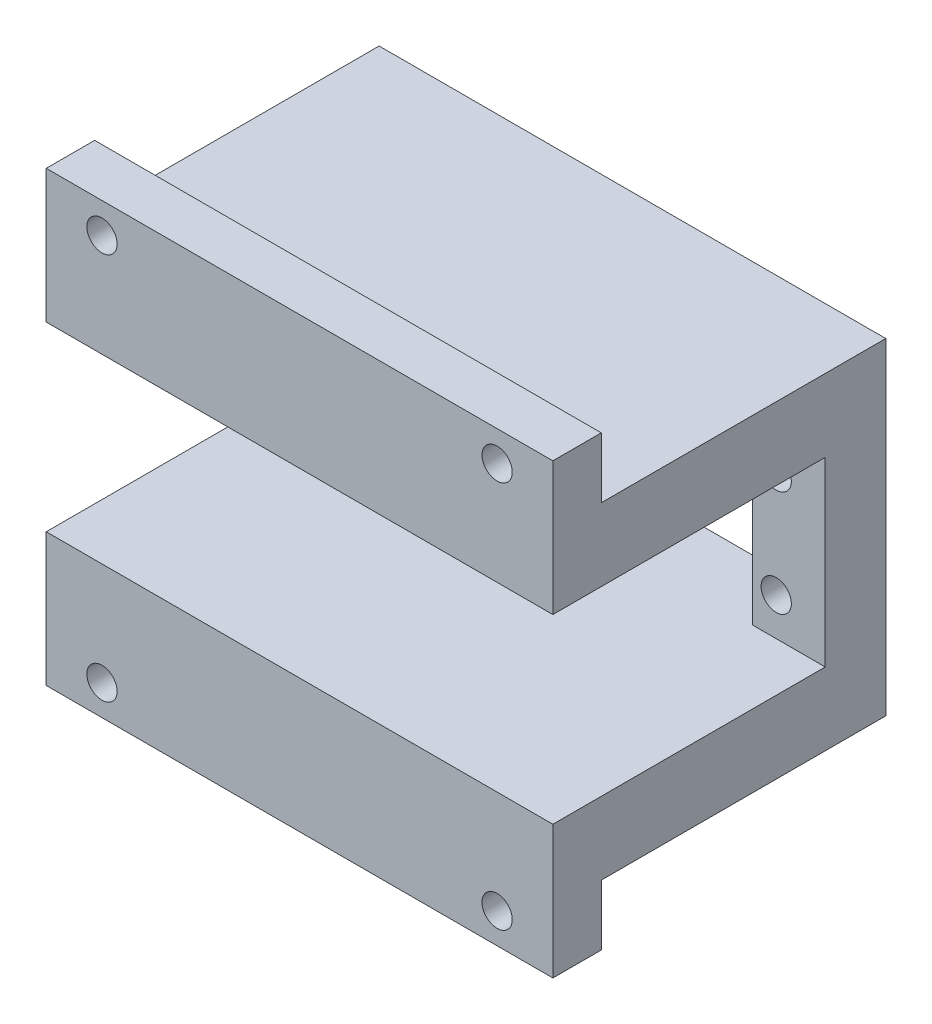
ISO-10303-21;
HEADER;
FILE_DESCRIPTION(('STEP AP214'),'2;1');
FILE_NAME('part.step','',(''),(''),'','','');
FILE_SCHEMA(('AUTOMOTIVE_DESIGN { 1 0 10303 214 1 1 1 1 }'));
ENDSEC;
DATA;
#1=APPLICATION_CONTEXT('core data for automotive mechanical design processes');
#2=APPLICATION_PROTOCOL_DEFINITION('international standard','automotive_design',2000,#1);
#3=PRODUCT_CONTEXT('',#1,'mechanical');
#4=PRODUCT('Part','Part','',(#3));
#5=PRODUCT_RELATED_PRODUCT_CATEGORY('part','',(#4));
#6=PRODUCT_DEFINITION_FORMATION('','',#4);
#7=PRODUCT_DEFINITION_CONTEXT('part definition',#1,'design');
#8=PRODUCT_DEFINITION('design','',#6,#7);
#9=PRODUCT_DEFINITION_SHAPE('','',#8);
#10=(LENGTH_UNIT() NAMED_UNIT(*) SI_UNIT(.MILLI.,.METRE.));
#11=(NAMED_UNIT(*) PLANE_ANGLE_UNIT() SI_UNIT($,.RADIAN.));
#12=(NAMED_UNIT(*) SI_UNIT($,.STERADIAN.) SOLID_ANGLE_UNIT());
#13=UNCERTAINTY_MEASURE_WITH_UNIT(LENGTH_MEASURE(1.E-05),#10,'distance_accuracy_value','');
#14=(GEOMETRIC_REPRESENTATION_CONTEXT(3) GLOBAL_UNCERTAINTY_ASSIGNED_CONTEXT((#13)) GLOBAL_UNIT_ASSIGNED_CONTEXT((#10,
#11,#12)) REPRESENTATION_CONTEXT('',''));
#15=CARTESIAN_POINT('',(0.,0.,0.));
#16=DIRECTION('',(0.,0.,1.));
#17=DIRECTION('',(1.,0.,0.));
#18=AXIS2_PLACEMENT_3D('',#15,#16,#17);
#19=CARTESIAN_POINT('',(-33.0810846652941,-3.76336844075865,10.));
#20=DIRECTION('',(0.,1.,0.));
#21=DIRECTION('',(-1.,0.,0.));
#22=AXIS2_PLACEMENT_3D('',#19,#20,#21);
#23=PLANE('',#22);
#24=DIRECTION('',(1.,0.,0.));
#25=VECTOR('',#24,1.);
#26=CARTESIAN_POINT('',(-33.0810846652941,-3.76336844075865,47.));
#27=LINE('',#26,#25);
#28=CARTESIAN_POINT('',(-33.0810846652941,-3.76336844075865,47.));
#29=VERTEX_POINT('',#28);
#30=CARTESIAN_POINT('',(50.6189153347059,-3.76336844075865,47.));
#31=VERTEX_POINT('',#30);
#32=EDGE_CURVE('E56',#29,#31,#27,.T.);
#33=ORIENTED_EDGE('',*,*,#32,.F.);
#34=DIRECTION('',(0.,0.,-1.));
#35=VECTOR('',#34,1.);
#36=CARTESIAN_POINT('',(-33.0810846652941,-3.76336844075865,10.));
#37=LINE('',#36,#35);
#38=CARTESIAN_POINT('',(-33.0810846652941,-3.76336844075865,0.));
#39=VERTEX_POINT('',#38);
#40=EDGE_CURVE('E348',#29,#39,#37,.T.);
#41=ORIENTED_EDGE('',*,*,#40,.T.);
#42=DIRECTION('',(1.,0.,0.));
#43=VECTOR('',#42,1.);
#44=CARTESIAN_POINT('',(-33.0810846652941,-3.76336844075865,0.));
#45=LINE('',#44,#43);
#46=CARTESIAN_POINT('',(50.6189153347059,-3.76336844075865,0.));
#47=VERTEX_POINT('',#46);
#48=EDGE_CURVE('E341',#39,#47,#45,.T.);
#49=ORIENTED_EDGE('',*,*,#48,.T.);
#50=DIRECTION('',(0.,0.,-1.));
#51=VECTOR('',#50,1.);
#52=CARTESIAN_POINT('',(50.6189153347059,-3.76336844075865,10.));
#53=LINE('',#52,#51);
#54=EDGE_CURVE('E35',#31,#47,#53,.T.);
#55=ORIENTED_EDGE('',*,*,#54,.F.);
#56=EDGE_LOOP('',(#33,#41,#49,#55));
#57=FACE_BOUND('',#56,.T.);
#58=ADVANCED_FACE('F32',(#57),#23,.F.);
#59=CARTESIAN_POINT('',(0.,0.,10.));
#60=DIRECTION('',(0.,0.,1.));
#61=DIRECTION('',(1.,0.,0.));
#62=AXIS2_PLACEMENT_3D('',#59,#60,#61);
#63=PLANE('',#62);
#64=CARTESIAN_POINT('',(42.5189153347059,31.9866315592413,10.));
#65=DIRECTION('',(0.,0.,1.));
#66=DIRECTION('',(1.,0.,0.));
#67=AXIS2_PLACEMENT_3D('',#64,#65,#66);
#68=CIRCLE('',#67,2.5);
#69=CARTESIAN_POINT('',(45.0189153347059,31.9866315592413,10.));
#70=VERTEX_POINT('',#69);
#71=EDGE_CURVE('E266',#70,#70,#68,.T.);
#72=ORIENTED_EDGE('',*,*,#71,.F.);
#73=EDGE_LOOP('',(#72));
#74=FACE_BOUND('',#73,.T.);
#75=CARTESIAN_POINT('',(42.5189153347059,14.4866315592413,10.));
#76=DIRECTION('',(0.,0.,1.));
#77=DIRECTION('',(-1.,0.,0.));
#78=AXIS2_PLACEMENT_3D('',#75,#76,#77);
#79=CIRCLE('',#78,2.5);
#80=CARTESIAN_POINT('',(40.0189153347059,14.4866315592413,10.));
#81=VERTEX_POINT('',#80);
#82=EDGE_CURVE('E260',#81,#81,#79,.T.);
#83=ORIENTED_EDGE('',*,*,#82,.F.);
#84=EDGE_LOOP('',(#83));
#85=FACE_BOUND('',#84,.T.);
#86=DIRECTION('',(0.,1.,0.));
#87=VECTOR('',#86,1.);
#88=CARTESIAN_POINT('',(50.6189153347059,-3.76336844075865,10.));
#89=LINE('',#88,#87);
#90=CARTESIAN_POINT('',(50.6189153347059,8.23663155924135,10.));
#91=VERTEX_POINT('',#90);
#92=CARTESIAN_POINT('',(50.6189153347059,38.2366315592414,10.));
#93=VERTEX_POINT('',#92);
#94=EDGE_CURVE('E342',#91,#93,#89,.T.);
#95=ORIENTED_EDGE('',*,*,#94,.T.);
#96=DIRECTION('',(1.,0.,0.));
#97=VECTOR('',#96,1.);
#98=CARTESIAN_POINT('',(-33.0810846652941,38.2366315592413,10.));
#99=LINE('',#98,#97);
#100=CARTESIAN_POINT('',(38.6189153347059,38.2366315592414,10.));
#101=VERTEX_POINT('',#100);
#102=EDGE_CURVE('E236',#101,#93,#99,.T.);
#103=ORIENTED_EDGE('',*,*,#102,.F.);
#104=DIRECTION('',(0.,1.,0.));
#105=VECTOR('',#104,1.);
#106=CARTESIAN_POINT('',(38.6189153347059,8.23663155924135,10.));
#107=LINE('',#106,#105);
#108=CARTESIAN_POINT('',(38.6189153347059,8.23663155924135,10.));
#109=VERTEX_POINT('',#108);
#110=EDGE_CURVE('E292',#109,#101,#107,.T.);
#111=ORIENTED_EDGE('',*,*,#110,.F.);
#112=DIRECTION('',(-1.,0.,0.));
#113=VECTOR('',#112,1.);
#114=CARTESIAN_POINT('',(-33.0810846652941,8.23663155924135,10.));
#115=LINE('',#114,#113);
#116=EDGE_CURVE('E41',#91,#109,#115,.T.);
#117=ORIENTED_EDGE('',*,*,#116,.F.);
#118=EDGE_LOOP('',(#95,#103,#111,#117));
#119=FACE_BOUND('',#118,.T.);
#120=ADVANCED_FACE('F394',(#74,#85,#119),#63,.T.);
#121=CARTESIAN_POINT('',(-24.9810846652941,31.9866315592413,10.));
#122=DIRECTION('',(0.,0.,1.));
#123=DIRECTION('',(-1.,0.,0.));
#124=AXIS2_PLACEMENT_3D('',#121,#122,#123);
#125=CIRCLE('',#124,2.5);
#126=CARTESIAN_POINT('',(-27.4810846652941,31.9866315592413,10.));
#127=VERTEX_POINT('',#126);
#128=EDGE_CURVE('E272',#127,#127,#125,.T.);
#129=ORIENTED_EDGE('',*,*,#128,.F.);
#130=EDGE_LOOP('',(#129));
#131=FACE_BOUND('',#130,.T.);
#132=CARTESIAN_POINT('',(-24.9810846652941,14.4866315592413,10.));
#133=DIRECTION('',(0.,0.,1.));
#134=DIRECTION('',(1.,0.,0.));
#135=AXIS2_PLACEMENT_3D('',#132,#133,#134);
#136=CIRCLE('',#135,2.5);
#137=CARTESIAN_POINT('',(-22.4810846652941,14.4866315592413,10.));
#138=VERTEX_POINT('',#137);
#139=EDGE_CURVE('E278',#138,#138,#136,.T.);
#140=ORIENTED_EDGE('',*,*,#139,.F.);
#141=EDGE_LOOP('',(#140));
#142=FACE_BOUND('',#141,.T.);
#143=DIRECTION('',(0.,-1.,0.));
#144=VECTOR('',#143,1.);
#145=CARTESIAN_POINT('',(-21.0810846652941,38.2366315592413,10.));
#146=LINE('',#145,#144);
#147=CARTESIAN_POINT('',(-21.0810846652941,38.2366315592413,10.));
#148=VERTEX_POINT('',#147);
#149=CARTESIAN_POINT('',(-21.0810846652941,26.7366315592413,10.));
#150=VERTEX_POINT('',#149);
#151=EDGE_CURVE('E295',#148,#150,#146,.T.);
#152=ORIENTED_EDGE('',*,*,#151,.F.);
#153=CARTESIAN_POINT('',(-33.0810846652941,38.2366315592413,10.));
#154=VERTEX_POINT('',#153);
#155=EDGE_CURVE('E239',#154,#148,#99,.T.);
#156=ORIENTED_EDGE('',*,*,#155,.F.);
#157=DIRECTION('',(0.,-1.,0.));
#158=VECTOR('',#157,1.);
#159=CARTESIAN_POINT('',(-33.0810846652941,7.26530537986886,10.));
#160=LINE('',#159,#158);
#161=CARTESIAN_POINT('',(-33.0810846652941,8.23663155924135,10.));
#162=VERTEX_POINT('',#161);
#163=EDGE_CURVE('E345',#154,#162,#160,.T.);
#164=ORIENTED_EDGE('',*,*,#163,.T.);
#165=CARTESIAN_POINT('',(-21.0810846652941,8.23663155924135,10.));
#166=VERTEX_POINT('',#165);
#167=EDGE_CURVE('E11',#166,#162,#115,.T.);
#168=ORIENTED_EDGE('',*,*,#167,.F.);
#169=DIRECTION('',(0.,-1.,0.));
#170=VECTOR('',#169,1.);
#171=CARTESIAN_POINT('',(-21.0810846652941,19.7366315592413,10.));
#172=LINE('',#171,#170);
#173=CARTESIAN_POINT('',(-21.0810846652941,19.7366315592413,10.));
#174=VERTEX_POINT('',#173);
#175=EDGE_CURVE('E289',#174,#166,#172,.T.);
#176=ORIENTED_EDGE('',*,*,#175,.F.);
#177=DIRECTION('',(1.,0.,0.));
#178=VECTOR('',#177,1.);
#179=CARTESIAN_POINT('',(-24.6810846652941,19.7366315592413,10.));
#180=LINE('',#179,#178);
#181=CARTESIAN_POINT('',(-24.6810846652941,19.7366315592413,10.));
#182=VERTEX_POINT('',#181);
#183=EDGE_CURVE('E286',#182,#174,#180,.T.);
#184=ORIENTED_EDGE('',*,*,#183,.F.);
#185=CARTESIAN_POINT('',(-24.7796957764052,23.2366315592413,10.));
#186=DIRECTION('',(0.,0.,1.));
#187=DIRECTION('',(1.,0.,0.));
#188=AXIS2_PLACEMENT_3D('',#185,#186,#187);
#189=CIRCLE('',#188,3.50138888888889);
#190=CARTESIAN_POINT('',(-24.6810846652941,26.7366315592413,10.));
#191=VERTEX_POINT('',#190);
#192=EDGE_CURVE('E284',#191,#182,#189,.T.);
#193=ORIENTED_EDGE('',*,*,#192,.F.);
#194=DIRECTION('',(-1.,0.,0.));
#195=VECTOR('',#194,1.);
#196=CARTESIAN_POINT('',(-24.6810846652941,26.7366315592413,10.));
#197=LINE('',#196,#195);
#198=EDGE_CURVE('E298',#150,#191,#197,.T.);
#199=ORIENTED_EDGE('',*,*,#198,.F.);
#200=EDGE_LOOP('',(#152,#156,#164,#168,#176,#184,#193,#199));
#201=FACE_BOUND('',#200,.T.);
#202=ADVANCED_FACE('F398',(#131,#142,#201),#63,.T.);
#203=CARTESIAN_POINT('',(0.,0.,0.));
#204=DIRECTION('',(0.,0.,1.));
#205=DIRECTION('',(1.,0.,0.));
#206=AXIS2_PLACEMENT_3D('',#203,#204,#205);
#207=PLANE('',#206);
#208=ORIENTED_EDGE('',*,*,#48,.F.);
#209=DIRECTION('',(0.,-1.,0.));
#210=VECTOR('',#209,1.);
#211=CARTESIAN_POINT('',(-33.0810846652941,4.52284595737369,0.));
#212=LINE('',#211,#210);
#213=CARTESIAN_POINT('',(-33.0810846652941,50.2366315592414,0.));
#214=VERTEX_POINT('',#213);
#215=EDGE_CURVE('E346',#214,#39,#212,.T.);
#216=ORIENTED_EDGE('',*,*,#215,.F.);
#217=DIRECTION('',(-1.,0.,0.));
#218=VECTOR('',#217,1.);
#219=CARTESIAN_POINT('',(-33.0810846652941,50.2366315592414,0.));
#220=LINE('',#219,#218);
#221=CARTESIAN_POINT('',(50.6189153347059,50.2366315592414,0.));
#222=VERTEX_POINT('',#221);
#223=EDGE_CURVE('E354',#222,#214,#220,.T.);
#224=ORIENTED_EDGE('',*,*,#223,.F.);
#225=DIRECTION('',(0.,1.,0.));
#226=VECTOR('',#225,1.);
#227=CARTESIAN_POINT('',(50.6189153347059,4.52284595737371,0.));
#228=LINE('',#227,#226);
#229=EDGE_CURVE('E351',#47,#222,#228,.T.);
#230=ORIENTED_EDGE('',*,*,#229,.F.);
#231=EDGE_LOOP('',(#208,#216,#224,#230));
#232=FACE_BOUND('',#231,.T.);
#233=CARTESIAN_POINT('',(-24.7796957764052,23.2366315592413,0.));
#234=DIRECTION('',(0.,0.,1.));
#235=DIRECTION('',(1.,0.,0.));
#236=AXIS2_PLACEMENT_3D('',#233,#234,#235);
#237=CIRCLE('',#236,3.50138888888889);
#238=CARTESIAN_POINT('',(-24.6810846652941,26.7366315592413,0.));
#239=VERTEX_POINT('',#238);
#240=CARTESIAN_POINT('',(-24.6810846652941,19.7366315592413,0.));
#241=VERTEX_POINT('',#240);
#242=EDGE_CURVE('E281',#239,#241,#237,.T.);
#243=ORIENTED_EDGE('',*,*,#242,.T.);
#244=DIRECTION('',(1.,0.,0.));
#245=VECTOR('',#244,1.);
#246=CARTESIAN_POINT('',(-24.6810846652941,19.7366315592413,0.));
#247=LINE('',#246,#245);
#248=CARTESIAN_POINT('',(-21.0810846652941,19.7366315592413,0.));
#249=VERTEX_POINT('',#248);
#250=EDGE_CURVE('E303',#241,#249,#247,.T.);
#251=ORIENTED_EDGE('',*,*,#250,.T.);
#252=DIRECTION('',(0.,-1.,0.));
#253=VECTOR('',#252,1.);
#254=CARTESIAN_POINT('',(-21.0810846652941,19.7366315592413,0.));
#255=LINE('',#254,#253);
#256=CARTESIAN_POINT('',(-21.0810846652941,8.23663155924135,0.));
#257=VERTEX_POINT('',#256);
#258=EDGE_CURVE('E306',#249,#257,#255,.T.);
#259=ORIENTED_EDGE('',*,*,#258,.T.);
#260=DIRECTION('',(1.,0.,0.));
#261=VECTOR('',#260,1.);
#262=CARTESIAN_POINT('',(15.8484692283495,8.23663155924134,0.));
#263=LINE('',#262,#261);
#264=CARTESIAN_POINT('',(38.6189153347059,8.23663155924135,0.));
#265=VERTEX_POINT('',#264);
#266=EDGE_CURVE('E309',#257,#265,#263,.T.);
#267=ORIENTED_EDGE('',*,*,#266,.T.);
#268=DIRECTION('',(0.,1.,0.));
#269=VECTOR('',#268,1.);
#270=CARTESIAN_POINT('',(38.6189153347059,8.23663155924135,0.));
#271=LINE('',#270,#269);
#272=CARTESIAN_POINT('',(38.6189153347059,38.2366315592413,0.));
#273=VERTEX_POINT('',#272);
#274=EDGE_CURVE('E312',#265,#273,#271,.T.);
#275=ORIENTED_EDGE('',*,*,#274,.T.);
#276=DIRECTION('',(-1.,0.,0.));
#277=VECTOR('',#276,1.);
#278=CARTESIAN_POINT('',(38.6189153347059,38.2366315592413,0.));
#279=LINE('',#278,#277);
#280=CARTESIAN_POINT('',(-21.0810846652941,38.2366315592413,0.));
#281=VERTEX_POINT('',#280);
#282=EDGE_CURVE('E315',#273,#281,#279,.T.);
#283=ORIENTED_EDGE('',*,*,#282,.T.);
#284=DIRECTION('',(0.,-1.,0.));
#285=VECTOR('',#284,1.);
#286=CARTESIAN_POINT('',(-21.0810846652941,38.2366315592413,0.));
#287=LINE('',#286,#285);
#288=CARTESIAN_POINT('',(-21.0810846652941,26.7366315592413,0.));
#289=VERTEX_POINT('',#288);
#290=EDGE_CURVE('E318',#281,#289,#287,.T.);
#291=ORIENTED_EDGE('',*,*,#290,.T.);
#292=DIRECTION('',(-1.,0.,0.));
#293=VECTOR('',#292,1.);
#294=CARTESIAN_POINT('',(-24.6810846652941,26.7366315592413,0.));
#295=LINE('',#294,#293);
#296=EDGE_CURVE('E287',#289,#239,#295,.T.);
#297=ORIENTED_EDGE('',*,*,#296,.T.);
#298=EDGE_LOOP('',(#243,#251,#259,#267,#275,#283,#291,#297));
#299=FACE_BOUND('',#298,.T.);
#300=CARTESIAN_POINT('',(-24.9810846652941,14.4866315592413,0.));
#301=DIRECTION('',(0.,0.,1.));
#302=DIRECTION('',(1.,0.,0.));
#303=AXIS2_PLACEMENT_3D('',#300,#301,#302);
#304=CIRCLE('',#303,2.5);
#305=CARTESIAN_POINT('',(-22.4810846652941,14.4866315592413,0.));
#306=VERTEX_POINT('',#305);
#307=EDGE_CURVE('E275',#306,#306,#304,.T.);
#308=ORIENTED_EDGE('',*,*,#307,.T.);
#309=EDGE_LOOP('',(#308));
#310=FACE_BOUND('',#309,.T.);
#311=CARTESIAN_POINT('',(-24.9810846652941,31.9866315592413,0.));
#312=DIRECTION('',(0.,0.,1.));
#313=DIRECTION('',(-1.,0.,0.));
#314=AXIS2_PLACEMENT_3D('',#311,#312,#313);
#315=CIRCLE('',#314,2.5);
#316=CARTESIAN_POINT('',(-27.4810846652941,31.9866315592413,0.));
#317=VERTEX_POINT('',#316);
#318=EDGE_CURVE('E269',#317,#317,#315,.T.);
#319=ORIENTED_EDGE('',*,*,#318,.T.);
#320=EDGE_LOOP('',(#319));
#321=FACE_BOUND('',#320,.T.);
#322=CARTESIAN_POINT('',(42.5189153347059,31.9866315592413,0.));
#323=DIRECTION('',(0.,0.,1.));
#324=DIRECTION('',(1.,0.,0.));
#325=AXIS2_PLACEMENT_3D('',#322,#323,#324);
#326=CIRCLE('',#325,2.5);
#327=CARTESIAN_POINT('',(45.0189153347059,31.9866315592413,0.));
#328=VERTEX_POINT('',#327);
#329=EDGE_CURVE('E263',#328,#328,#326,.T.);
#330=ORIENTED_EDGE('',*,*,#329,.T.);
#331=EDGE_LOOP('',(#330));
#332=FACE_BOUND('',#331,.T.);
#333=CARTESIAN_POINT('',(42.5189153347059,14.4866315592413,0.));
#334=DIRECTION('',(0.,0.,1.));
#335=DIRECTION('',(-1.,0.,0.));
#336=AXIS2_PLACEMENT_3D('',#333,#334,#335);
#337=CIRCLE('',#336,2.5);
#338=CARTESIAN_POINT('',(40.0189153347059,14.4866315592413,0.));
#339=VERTEX_POINT('',#338);
#340=EDGE_CURVE('E259',#339,#339,#337,.T.);
#341=ORIENTED_EDGE('',*,*,#340,.T.);
#342=EDGE_LOOP('',(#341));
#343=FACE_BOUND('',#342,.T.);
#344=ADVANCED_FACE('F371',(#232,#299,#310,#321,#332,#343),#207,.F.);
#345=CARTESIAN_POINT('',(50.6189153347059,4.52284595737371,10.));
#346=DIRECTION('',(-1.,0.,0.));
#347=DIRECTION('',(0.,0.,1.));
#348=AXIS2_PLACEMENT_3D('',#345,#346,#347);
#349=PLANE('',#348);
#350=ORIENTED_EDGE('',*,*,#229,.T.);
#351=DIRECTION('',(0.,0.,-1.));
#352=VECTOR('',#351,1.);
#353=CARTESIAN_POINT('',(50.6189153347059,50.2366315592414,10.));
#354=LINE('',#353,#352);
#355=CARTESIAN_POINT('',(50.6189153347059,50.2366315592414,47.));
#356=VERTEX_POINT('',#355);
#357=EDGE_CURVE('E360',#356,#222,#354,.T.);
#358=ORIENTED_EDGE('',*,*,#357,.F.);
#359=DIRECTION('',(0.,-1.,0.));
#360=VECTOR('',#359,1.);
#361=CARTESIAN_POINT('',(50.6189153347059,60.2366315592413,47.));
#362=LINE('',#361,#360);
#363=CARTESIAN_POINT('',(50.6189153347059,60.2366315592413,47.));
#364=VERTEX_POINT('',#363);
#365=EDGE_CURVE('E48',#364,#356,#362,.T.);
#366=ORIENTED_EDGE('',*,*,#365,.F.);
#367=DIRECTION('',(0.,0.,1.));
#368=VECTOR('',#367,1.);
#369=CARTESIAN_POINT('',(50.6189153347059,60.2366315592413,55.));
#370=LINE('',#369,#368);
#371=CARTESIAN_POINT('',(50.6189153347059,60.2366315592413,55.));
#372=VERTEX_POINT('',#371);
#373=EDGE_CURVE('E195',#364,#372,#370,.T.);
#374=ORIENTED_EDGE('',*,*,#373,.T.);
#375=DIRECTION('',(0.,1.,0.));
#376=VECTOR('',#375,1.);
#377=CARTESIAN_POINT('',(50.6189153347059,38.2366315592414,55.));
#378=LINE('',#377,#376);
#379=CARTESIAN_POINT('',(50.6189153347059,38.2366315592414,55.));
#380=VERTEX_POINT('',#379);
#381=EDGE_CURVE('E183',#380,#372,#378,.T.);
#382=ORIENTED_EDGE('',*,*,#381,.F.);
#383=DIRECTION('',(0.,0.,-1.));
#384=VECTOR('',#383,1.);
#385=CARTESIAN_POINT('',(50.6189153347059,38.2366315592414,55.));
#386=LINE('',#385,#384);
#387=EDGE_CURVE('E243',#380,#93,#386,.T.);
#388=ORIENTED_EDGE('',*,*,#387,.T.);
#389=ORIENTED_EDGE('',*,*,#94,.F.);
#390=DIRECTION('',(0.,0.,-1.));
#391=VECTOR('',#390,1.);
#392=CARTESIAN_POINT('',(50.6189153347059,8.23663155924135,55.));
#393=LINE('',#392,#391);
#394=CARTESIAN_POINT('',(50.6189153347059,8.23663155924135,55.));
#395=VERTEX_POINT('',#394);
#396=EDGE_CURVE('E256',#395,#91,#393,.T.);
#397=ORIENTED_EDGE('',*,*,#396,.F.);
#398=DIRECTION('',(0.,1.,0.));
#399=VECTOR('',#398,1.);
#400=CARTESIAN_POINT('',(50.6189153347059,8.23663155924135,55.));
#401=LINE('',#400,#399);
#402=CARTESIAN_POINT('',(50.6189153347059,-13.7633684407587,55.));
#403=VERTEX_POINT('',#402);
#404=EDGE_CURVE('E248',#403,#395,#401,.T.);
#405=ORIENTED_EDGE('',*,*,#404,.F.);
#406=DIRECTION('',(0.,0.,1.));
#407=VECTOR('',#406,1.);
#408=CARTESIAN_POINT('',(50.6189153347059,-13.7633684407587,55.));
#409=LINE('',#408,#407);
#410=CARTESIAN_POINT('',(50.6189153347059,-13.7633684407587,47.));
#411=VERTEX_POINT('',#410);
#412=EDGE_CURVE('E223',#411,#403,#409,.T.);
#413=ORIENTED_EDGE('',*,*,#412,.F.);
#414=DIRECTION('',(0.,1.,0.));
#415=VECTOR('',#414,1.);
#416=CARTESIAN_POINT('',(50.6189153347059,-13.7633684407587,47.));
#417=LINE('',#416,#415);
#418=EDGE_CURVE('E229',#411,#31,#417,.T.);
#419=ORIENTED_EDGE('',*,*,#418,.T.);
#420=ORIENTED_EDGE('',*,*,#54,.T.);
#421=EDGE_LOOP('',(#350,#358,#366,#374,#382,#388,#389,#397,#405,#413,#419,#420));
#422=FACE_BOUND('',#421,.T.);
#423=ADVANCED_FACE('F365',(#422),#349,.F.);
#424=CARTESIAN_POINT('',(-33.0810846652941,50.2366315592414,10.));
#425=DIRECTION('',(0.,-1.,0.));
#426=DIRECTION('',(0.,0.,-1.));
#427=AXIS2_PLACEMENT_3D('',#424,#425,#426);
#428=PLANE('',#427);
#429=DIRECTION('',(0.,0.,-1.));
#430=VECTOR('',#429,1.);
#431=CARTESIAN_POINT('',(-33.0810846652941,50.2366315592414,10.));
#432=LINE('',#431,#430);
#433=CARTESIAN_POINT('',(-33.0810846652941,50.2366315592413,47.));
#434=VERTEX_POINT('',#433);
#435=EDGE_CURVE('E359',#434,#214,#432,.T.);
#436=ORIENTED_EDGE('',*,*,#435,.F.);
#437=DIRECTION('',(1.,0.,0.));
#438=VECTOR('',#437,1.);
#439=CARTESIAN_POINT('',(-33.0810846652941,50.2366315592413,47.));
#440=LINE('',#439,#438);
#441=EDGE_CURVE('E192',#434,#356,#440,.T.);
#442=ORIENTED_EDGE('',*,*,#441,.T.);
#443=ORIENTED_EDGE('',*,*,#357,.T.);
#444=ORIENTED_EDGE('',*,*,#223,.T.);
#445=EDGE_LOOP('',(#436,#442,#443,#444));
#446=FACE_BOUND('',#445,.T.);
#447=ADVANCED_FACE('F376',(#446),#428,.F.);
#448=CARTESIAN_POINT('',(-33.0810846652941,4.52284595737369,10.));
#449=DIRECTION('',(1.,0.,0.));
#450=DIRECTION('',(0.,1.,0.));
#451=AXIS2_PLACEMENT_3D('',#448,#449,#450);
#452=PLANE('',#451);
#453=ORIENTED_EDGE('',*,*,#215,.T.);
#454=ORIENTED_EDGE('',*,*,#40,.F.);
#455=DIRECTION('',(0.,1.,0.));
#456=VECTOR('',#455,1.);
#457=CARTESIAN_POINT('',(-33.0810846652941,-13.7633684407587,47.));
#458=LINE('',#457,#456);
#459=CARTESIAN_POINT('',(-33.0810846652941,-13.7633684407587,47.));
#460=VERTEX_POINT('',#459);
#461=EDGE_CURVE('E233',#460,#29,#458,.T.);
#462=ORIENTED_EDGE('',*,*,#461,.F.);
#463=DIRECTION('',(0.,0.,-1.));
#464=VECTOR('',#463,1.);
#465=CARTESIAN_POINT('',(-33.0810846652941,-13.7633684407587,55.));
#466=LINE('',#465,#464);
#467=CARTESIAN_POINT('',(-33.0810846652941,-13.7633684407587,55.));
#468=VERTEX_POINT('',#467);
#469=EDGE_CURVE('E218',#468,#460,#466,.T.);
#470=ORIENTED_EDGE('',*,*,#469,.F.);
#471=DIRECTION('',(0.,-1.,0.));
#472=VECTOR('',#471,1.);
#473=CARTESIAN_POINT('',(-33.0810846652941,8.23663155924135,55.));
#474=LINE('',#473,#472);
#475=CARTESIAN_POINT('',(-33.0810846652941,8.23663155924135,55.));
#476=VERTEX_POINT('',#475);
#477=EDGE_CURVE('E246',#476,#468,#474,.T.);
#478=ORIENTED_EDGE('',*,*,#477,.F.);
#479=DIRECTION('',(0.,0.,-1.));
#480=VECTOR('',#479,1.);
#481=CARTESIAN_POINT('',(-33.0810846652941,8.23663155924135,55.));
#482=LINE('',#481,#480);
#483=EDGE_CURVE('E251',#476,#162,#482,.T.);
#484=ORIENTED_EDGE('',*,*,#483,.T.);
#485=ORIENTED_EDGE('',*,*,#163,.F.);
#486=DIRECTION('',(0.,0.,-1.));
#487=VECTOR('',#486,1.);
#488=CARTESIAN_POINT('',(-33.0810846652941,38.2366315592413,55.));
#489=LINE('',#488,#487);
#490=CARTESIAN_POINT('',(-33.0810846652941,38.2366315592413,55.));
#491=VERTEX_POINT('',#490);
#492=EDGE_CURVE('E178',#491,#154,#489,.T.);
#493=ORIENTED_EDGE('',*,*,#492,.F.);
#494=DIRECTION('',(0.,-1.,0.));
#495=VECTOR('',#494,1.);
#496=CARTESIAN_POINT('',(-33.0810846652941,38.2366315592413,55.));
#497=LINE('',#496,#495);
#498=CARTESIAN_POINT('',(-33.0810846652941,60.2366315592413,55.));
#499=VERTEX_POINT('',#498);
#500=EDGE_CURVE('E171',#499,#491,#497,.T.);
#501=ORIENTED_EDGE('',*,*,#500,.F.);
#502=DIRECTION('',(0.,0.,-1.));
#503=VECTOR('',#502,1.);
#504=CARTESIAN_POINT('',(-33.0810846652941,60.2366315592413,55.));
#505=LINE('',#504,#503);
#506=CARTESIAN_POINT('',(-33.0810846652941,60.2366315592413,47.));
#507=VERTEX_POINT('',#506);
#508=EDGE_CURVE('E175',#499,#507,#505,.T.);
#509=ORIENTED_EDGE('',*,*,#508,.T.);
#510=DIRECTION('',(0.,-1.,0.));
#511=VECTOR('',#510,1.);
#512=CARTESIAN_POINT('',(-33.0810846652941,60.2366315592413,47.));
#513=LINE('',#512,#511);
#514=EDGE_CURVE('E201',#507,#434,#513,.T.);
#515=ORIENTED_EDGE('',*,*,#514,.T.);
#516=ORIENTED_EDGE('',*,*,#435,.T.);
#517=EDGE_LOOP('',(#453,#454,#462,#470,#478,#484,#485,#493,#501,#509,#515,#516));
#518=FACE_BOUND('',#517,.T.);
#519=ADVANCED_FACE('F174',(#518),#452,.F.);
#520=CARTESIAN_POINT('',(-24.7796957764052,23.2366315592413,10.));
#521=DIRECTION('',(0.,0.,-1.));
#522=DIRECTION('',(-1.,0.,0.));
#523=AXIS2_PLACEMENT_3D('',#520,#521,#522);
#524=CYLINDRICAL_SURFACE('',#523,3.50138888888889);
#525=ORIENTED_EDGE('',*,*,#242,.F.);
#526=DIRECTION('',(0.,0.,-1.));
#527=VECTOR('',#526,1.);
#528=CARTESIAN_POINT('',(-24.6810846652941,26.7366315592413,10.));
#529=LINE('',#528,#527);
#530=EDGE_CURVE('E300',#191,#239,#529,.T.);
#531=ORIENTED_EDGE('',*,*,#530,.F.);
#532=ORIENTED_EDGE('',*,*,#192,.T.);
#533=DIRECTION('',(0.,0.,-1.));
#534=VECTOR('',#533,1.);
#535=CARTESIAN_POINT('',(-24.6810846652941,19.7366315592413,10.));
#536=LINE('',#535,#534);
#537=EDGE_CURVE('E338',#182,#241,#536,.T.);
#538=ORIENTED_EDGE('',*,*,#537,.T.);
#539=EDGE_LOOP('',(#525,#531,#532,#538));
#540=FACE_BOUND('',#539,.T.);
#541=ADVANCED_FACE('F409',(#540),#524,.F.);
#542=CARTESIAN_POINT('',(-24.6810846652941,19.7366315592413,10.));
#543=DIRECTION('',(0.,1.,0.));
#544=DIRECTION('',(0.,0.,1.));
#545=AXIS2_PLACEMENT_3D('',#542,#543,#544);
#546=PLANE('',#545);
#547=ORIENTED_EDGE('',*,*,#250,.F.);
#548=ORIENTED_EDGE('',*,*,#537,.F.);
#549=ORIENTED_EDGE('',*,*,#183,.T.);
#550=DIRECTION('',(0.,0.,-1.));
#551=VECTOR('',#550,1.);
#552=CARTESIAN_POINT('',(-21.0810846652941,19.7366315592413,10.));
#553=LINE('',#552,#551);
#554=EDGE_CURVE('E336',#174,#249,#553,.T.);
#555=ORIENTED_EDGE('',*,*,#554,.T.);
#556=EDGE_LOOP('',(#547,#548,#549,#555));
#557=FACE_BOUND('',#556,.T.);
#558=ADVANCED_FACE('F437',(#557),#546,.T.);
#559=CARTESIAN_POINT('',(-21.0810846652941,19.7366315592413,10.));
#560=DIRECTION('',(1.,0.,0.));
#561=DIRECTION('',(0.,0.,-1.));
#562=AXIS2_PLACEMENT_3D('',#559,#560,#561);
#563=PLANE('',#562);
#564=ORIENTED_EDGE('',*,*,#258,.F.);
#565=ORIENTED_EDGE('',*,*,#554,.F.);
#566=ORIENTED_EDGE('',*,*,#175,.T.);
#567=DIRECTION('',(0.,0.,-1.));
#568=VECTOR('',#567,1.);
#569=CARTESIAN_POINT('',(-21.0810846652941,8.23663155924135,10.));
#570=LINE('',#569,#568);
#571=EDGE_CURVE('E333',#166,#257,#570,.T.);
#572=ORIENTED_EDGE('',*,*,#571,.T.);
#573=EDGE_LOOP('',(#564,#565,#566,#572));
#574=FACE_BOUND('',#573,.T.);
#575=ADVANCED_FACE('F444',(#574),#563,.T.);
#576=CARTESIAN_POINT('',(15.8484692283495,8.23663155924134,10.));
#577=DIRECTION('',(0.,1.,0.));
#578=DIRECTION('',(-1.,0.,0.));
#579=AXIS2_PLACEMENT_3D('',#576,#577,#578);
#580=PLANE('',#579);
#581=ORIENTED_EDGE('',*,*,#266,.F.);
#582=ORIENTED_EDGE('',*,*,#571,.F.);
#583=ORIENTED_EDGE('',*,*,#167,.T.);
#584=ORIENTED_EDGE('',*,*,#483,.F.);
#585=DIRECTION('',(-1.,0.,0.));
#586=VECTOR('',#585,1.);
#587=CARTESIAN_POINT('',(-33.0810846652941,8.23663155924135,55.));
#588=LINE('',#587,#586);
#589=EDGE_CURVE('E250',#395,#476,#588,.T.);
#590=ORIENTED_EDGE('',*,*,#589,.F.);
#591=ORIENTED_EDGE('',*,*,#396,.T.);
#592=ORIENTED_EDGE('',*,*,#116,.T.);
#593=DIRECTION('',(0.,0.,-1.));
#594=VECTOR('',#593,1.);
#595=CARTESIAN_POINT('',(38.6189153347059,8.23663155924135,10.));
#596=LINE('',#595,#594);
#597=EDGE_CURVE('E331',#109,#265,#596,.T.);
#598=ORIENTED_EDGE('',*,*,#597,.T.);
#599=EDGE_LOOP('',(#581,#582,#583,#584,#590,#591,#592,#598));
#600=FACE_BOUND('',#599,.T.);
#601=ADVANCED_FACE('F452',(#600),#580,.T.);
#602=CARTESIAN_POINT('',(38.6189153347059,8.23663155924135,10.));
#603=DIRECTION('',(-1.,0.,0.));
#604=DIRECTION('',(0.,0.,1.));
#605=AXIS2_PLACEMENT_3D('',#602,#603,#604);
#606=PLANE('',#605);
#607=ORIENTED_EDGE('',*,*,#274,.F.);
#608=ORIENTED_EDGE('',*,*,#597,.F.);
#609=ORIENTED_EDGE('',*,*,#110,.T.);
#610=DIRECTION('',(0.,0.,-1.));
#611=VECTOR('',#610,1.);
#612=CARTESIAN_POINT('',(38.6189153347059,38.2366315592413,10.));
#613=LINE('',#612,#611);
#614=EDGE_CURVE('E329',#101,#273,#613,.T.);
#615=ORIENTED_EDGE('',*,*,#614,.T.);
#616=EDGE_LOOP('',(#607,#608,#609,#615));
#617=FACE_BOUND('',#616,.T.);
#618=ADVANCED_FACE('F461',(#617),#606,.T.);
#619=CARTESIAN_POINT('',(38.6189153347059,38.2366315592413,10.));
#620=DIRECTION('',(0.,-1.,0.));
#621=DIRECTION('',(0.,0.,-1.));
#622=AXIS2_PLACEMENT_3D('',#619,#620,#621);
#623=PLANE('',#622);
#624=ORIENTED_EDGE('',*,*,#282,.F.);
#625=ORIENTED_EDGE('',*,*,#614,.F.);
#626=ORIENTED_EDGE('',*,*,#102,.T.);
#627=ORIENTED_EDGE('',*,*,#387,.F.);
#628=DIRECTION('',(1.,0.,0.));
#629=VECTOR('',#628,1.);
#630=CARTESIAN_POINT('',(-33.0810846652941,38.2366315592413,55.));
#631=LINE('',#630,#629);
#632=EDGE_CURVE('E237',#491,#380,#631,.T.);
#633=ORIENTED_EDGE('',*,*,#632,.F.);
#634=ORIENTED_EDGE('',*,*,#492,.T.);
#635=ORIENTED_EDGE('',*,*,#155,.T.);
#636=DIRECTION('',(0.,0.,-1.));
#637=VECTOR('',#636,1.);
#638=CARTESIAN_POINT('',(-21.0810846652941,38.2366315592413,10.));
#639=LINE('',#638,#637);
#640=EDGE_CURVE('E327',#148,#281,#639,.T.);
#641=ORIENTED_EDGE('',*,*,#640,.T.);
#642=EDGE_LOOP('',(#624,#625,#626,#627,#633,#634,#635,#641));
#643=FACE_BOUND('',#642,.T.);
#644=ADVANCED_FACE('F469',(#643),#623,.T.);
#645=CARTESIAN_POINT('',(-21.0810846652941,38.2366315592413,10.));
#646=DIRECTION('',(1.,0.,0.));
#647=DIRECTION('',(0.,0.,-1.));
#648=AXIS2_PLACEMENT_3D('',#645,#646,#647);
#649=PLANE('',#648);
#650=ORIENTED_EDGE('',*,*,#290,.F.);
#651=ORIENTED_EDGE('',*,*,#640,.F.);
#652=ORIENTED_EDGE('',*,*,#151,.T.);
#653=DIRECTION('',(0.,0.,-1.));
#654=VECTOR('',#653,1.);
#655=CARTESIAN_POINT('',(-21.0810846652941,26.7366315592413,10.));
#656=LINE('',#655,#654);
#657=EDGE_CURVE('E325',#150,#289,#656,.T.);
#658=ORIENTED_EDGE('',*,*,#657,.T.);
#659=EDGE_LOOP('',(#650,#651,#652,#658));
#660=FACE_BOUND('',#659,.T.);
#661=ADVANCED_FACE('F477',(#660),#649,.T.);
#662=CARTESIAN_POINT('',(-24.6810846652941,26.7366315592413,10.));
#663=DIRECTION('',(0.,-1.,0.));
#664=DIRECTION('',(1.,0.,0.));
#665=AXIS2_PLACEMENT_3D('',#662,#663,#664);
#666=PLANE('',#665);
#667=ORIENTED_EDGE('',*,*,#296,.F.);
#668=ORIENTED_EDGE('',*,*,#657,.F.);
#669=ORIENTED_EDGE('',*,*,#198,.T.);
#670=ORIENTED_EDGE('',*,*,#530,.T.);
#671=EDGE_LOOP('',(#667,#668,#669,#670));
#672=FACE_BOUND('',#671,.T.);
#673=ADVANCED_FACE('F485',(#672),#666,.T.);
#674=CARTESIAN_POINT('',(-24.9810846652941,14.4866315592413,10.));
#675=DIRECTION('',(0.,0.,-1.));
#676=DIRECTION('',(-1.,0.,0.));
#677=AXIS2_PLACEMENT_3D('',#674,#675,#676);
#678=CYLINDRICAL_SURFACE('',#677,2.5);
#679=ORIENTED_EDGE('',*,*,#139,.T.);
#680=EDGE_LOOP('',(#679));
#681=FACE_BOUND('',#680,.T.);
#682=ORIENTED_EDGE('',*,*,#307,.F.);
#683=EDGE_LOOP('',(#682));
#684=FACE_BOUND('',#683,.T.);
#685=ADVANCED_FACE('F492',(#681,#684),#678,.F.);
#686=CARTESIAN_POINT('',(-24.9810846652941,31.9866315592413,10.));
#687=DIRECTION('',(0.,0.,-1.));
#688=DIRECTION('',(-1.,0.,0.));
#689=AXIS2_PLACEMENT_3D('',#686,#687,#688);
#690=CYLINDRICAL_SURFACE('',#689,2.5);
#691=ORIENTED_EDGE('',*,*,#128,.T.);
#692=EDGE_LOOP('',(#691));
#693=FACE_BOUND('',#692,.T.);
#694=ORIENTED_EDGE('',*,*,#318,.F.);
#695=EDGE_LOOP('',(#694));
#696=FACE_BOUND('',#695,.T.);
#697=ADVANCED_FACE('F500',(#693,#696),#690,.F.);
#698=CARTESIAN_POINT('',(42.5189153347059,31.9866315592413,10.));
#699=DIRECTION('',(0.,0.,-1.));
#700=DIRECTION('',(-1.,0.,0.));
#701=AXIS2_PLACEMENT_3D('',#698,#699,#700);
#702=CYLINDRICAL_SURFACE('',#701,2.5);
#703=ORIENTED_EDGE('',*,*,#71,.T.);
#704=EDGE_LOOP('',(#703));
#705=FACE_BOUND('',#704,.T.);
#706=ORIENTED_EDGE('',*,*,#329,.F.);
#707=EDGE_LOOP('',(#706));
#708=FACE_BOUND('',#707,.T.);
#709=ADVANCED_FACE('F508',(#705,#708),#702,.F.);
#710=CARTESIAN_POINT('',(42.5189153347059,14.4866315592413,10.));
#711=DIRECTION('',(0.,0.,-1.));
#712=DIRECTION('',(-1.,0.,0.));
#713=AXIS2_PLACEMENT_3D('',#710,#711,#712);
#714=CYLINDRICAL_SURFACE('',#713,2.5);
#715=ORIENTED_EDGE('',*,*,#82,.T.);
#716=EDGE_LOOP('',(#715));
#717=FACE_BOUND('',#716,.T.);
#718=ORIENTED_EDGE('',*,*,#340,.F.);
#719=EDGE_LOOP('',(#718));
#720=FACE_BOUND('',#719,.T.);
#721=ADVANCED_FACE('F516',(#717,#720),#714,.F.);
#722=CARTESIAN_POINT('',(0.,0.,55.));
#723=DIRECTION('',(0.,0.,1.));
#724=DIRECTION('',(1.,0.,0.));
#725=AXIS2_PLACEMENT_3D('',#722,#723,#724);
#726=PLANE('',#725);
#727=CARTESIAN_POINT('',(-23.8723079374916,-8.76336844075865,55.));
#728=DIRECTION('',(0.,0.,1.));
#729=DIRECTION('',(1.,0.,0.));
#730=AXIS2_PLACEMENT_3D('',#727,#728,#729);
#731=CIRCLE('',#730,2.5);
#732=CARTESIAN_POINT('',(-21.3723079374915,-8.76336844075865,55.));
#733=VERTEX_POINT('',#732);
#734=EDGE_CURVE('E206',#733,#733,#731,.F.);
#735=ORIENTED_EDGE('',*,*,#734,.T.);
#736=EDGE_LOOP('',(#735));
#737=FACE_BOUND('',#736,.T.);
#738=CARTESIAN_POINT('',(41.4101386069033,-8.76336844075865,55.));
#739=DIRECTION('',(0.,0.,1.));
#740=DIRECTION('',(1.,0.,0.));
#741=AXIS2_PLACEMENT_3D('',#738,#739,#740);
#742=CIRCLE('',#741,2.5);
#743=CARTESIAN_POINT('',(43.9101386069033,-8.76336844075865,55.));
#744=VERTEX_POINT('',#743);
#745=EDGE_CURVE('E210',#744,#744,#742,.F.);
#746=ORIENTED_EDGE('',*,*,#745,.T.);
#747=EDGE_LOOP('',(#746));
#748=FACE_BOUND('',#747,.T.);
#749=ORIENTED_EDGE('',*,*,#477,.T.);
#750=DIRECTION('',(-1.,0.,0.));
#751=VECTOR('',#750,1.);
#752=CARTESIAN_POINT('',(-33.0810846652941,-13.7633684407587,55.));
#753=LINE('',#752,#751);
#754=EDGE_CURVE('E226',#403,#468,#753,.T.);
#755=ORIENTED_EDGE('',*,*,#754,.F.);
#756=ORIENTED_EDGE('',*,*,#404,.T.);
#757=ORIENTED_EDGE('',*,*,#589,.T.);
#758=EDGE_LOOP('',(#749,#755,#756,#757));
#759=FACE_BOUND('',#758,.T.);
#760=ADVANCED_FACE('F524',(#737,#748,#759),#726,.T.);
#761=CARTESIAN_POINT('',(0.,0.,55.));
#762=DIRECTION('',(0.,0.,1.));
#763=DIRECTION('',(1.,0.,0.));
#764=AXIS2_PLACEMENT_3D('',#761,#762,#763);
#765=PLANE('',#764);
#766=CARTESIAN_POINT('',(-23.8723079374916,55.2366315592413,55.));
#767=DIRECTION('',(0.,0.,1.));
#768=DIRECTION('',(1.,0.,0.));
#769=AXIS2_PLACEMENT_3D('',#766,#767,#768);
#770=CIRCLE('',#769,2.5);
#771=CARTESIAN_POINT('',(-21.3723079374916,55.2366315592413,55.));
#772=VERTEX_POINT('',#771);
#773=EDGE_CURVE('E623',#772,#772,#770,.T.);
#774=ORIENTED_EDGE('',*,*,#773,.F.);
#775=EDGE_LOOP('',(#774));
#776=FACE_BOUND('',#775,.T.);
#777=CARTESIAN_POINT('',(41.4101386069033,55.2366315592413,55.));
#778=DIRECTION('',(0.,0.,1.));
#779=DIRECTION('',(1.,0.,0.));
#780=AXIS2_PLACEMENT_3D('',#777,#778,#779);
#781=CIRCLE('',#780,2.5);
#782=CARTESIAN_POINT('',(43.9101386069033,55.2366315592413,55.));
#783=VERTEX_POINT('',#782);
#784=EDGE_CURVE('E203',#783,#783,#781,.T.);
#785=ORIENTED_EDGE('',*,*,#784,.F.);
#786=EDGE_LOOP('',(#785));
#787=FACE_BOUND('',#786,.T.);
#788=ORIENTED_EDGE('',*,*,#632,.T.);
#789=ORIENTED_EDGE('',*,*,#381,.T.);
#790=DIRECTION('',(-1.,0.,0.));
#791=VECTOR('',#790,1.);
#792=CARTESIAN_POINT('',(-33.0810846652941,60.2366315592413,55.));
#793=LINE('',#792,#791);
#794=EDGE_CURVE('E189',#372,#499,#793,.T.);
#795=ORIENTED_EDGE('',*,*,#794,.T.);
#796=ORIENTED_EDGE('',*,*,#500,.T.);
#797=EDGE_LOOP('',(#788,#789,#795,#796));
#798=FACE_BOUND('',#797,.T.);
#799=ADVANCED_FACE('F194',(#776,#787,#798),#765,.T.);
#800=CARTESIAN_POINT('',(-33.0810846652941,-13.7633684407587,47.));
#801=DIRECTION('',(0.,0.,1.));
#802=DIRECTION('',(1.,0.,0.));
#803=AXIS2_PLACEMENT_3D('',#800,#801,#802);
#804=PLANE('',#803);
#805=CARTESIAN_POINT('',(-23.8723079374916,-8.76336844075865,47.));
#806=DIRECTION('',(0.,0.,-1.));
#807=DIRECTION('',(1.,0.,0.));
#808=AXIS2_PLACEMENT_3D('',#805,#806,#807);
#809=CIRCLE('',#808,2.5);
#810=CARTESIAN_POINT('',(-21.3723079374915,-8.76336844075865,47.));
#811=VERTEX_POINT('',#810);
#812=EDGE_CURVE('E207',#811,#811,#809,.T.);
#813=ORIENTED_EDGE('',*,*,#812,.F.);
#814=EDGE_LOOP('',(#813));
#815=FACE_BOUND('',#814,.T.);
#816=CARTESIAN_POINT('',(41.4101386069033,-8.76336844075865,47.));
#817=DIRECTION('',(0.,0.,-1.));
#818=DIRECTION('',(-1.,0.,0.));
#819=AXIS2_PLACEMENT_3D('',#816,#817,#818);
#820=CIRCLE('',#819,2.5);
#821=CARTESIAN_POINT('',(38.9101386069033,-8.76336844075865,47.));
#822=VERTEX_POINT('',#821);
#823=EDGE_CURVE('E213',#822,#822,#820,.T.);
#824=ORIENTED_EDGE('',*,*,#823,.F.);
#825=EDGE_LOOP('',(#824));
#826=FACE_BOUND('',#825,.T.);
#827=ORIENTED_EDGE('',*,*,#32,.T.);
#828=ORIENTED_EDGE('',*,*,#418,.F.);
#829=DIRECTION('',(1.,0.,0.));
#830=VECTOR('',#829,1.);
#831=CARTESIAN_POINT('',(-33.0810846652941,-13.7633684407587,47.));
#832=LINE('',#831,#830);
#833=EDGE_CURVE('E221',#460,#411,#832,.T.);
#834=ORIENTED_EDGE('',*,*,#833,.F.);
#835=ORIENTED_EDGE('',*,*,#461,.T.);
#836=EDGE_LOOP('',(#827,#828,#834,#835));
#837=FACE_BOUND('',#836,.T.);
#838=ADVANCED_FACE('F540',(#815,#826,#837),#804,.F.);
#839=CARTESIAN_POINT('',(0.,-13.7633684407587,0.));
#840=DIRECTION('',(0.,-1.,0.));
#841=DIRECTION('',(1.,0.,0.));
#842=AXIS2_PLACEMENT_3D('',#839,#840,#841);
#843=PLANE('',#842);
#844=ORIENTED_EDGE('',*,*,#469,.T.);
#845=ORIENTED_EDGE('',*,*,#833,.T.);
#846=ORIENTED_EDGE('',*,*,#412,.T.);
#847=ORIENTED_EDGE('',*,*,#754,.T.);
#848=EDGE_LOOP('',(#844,#845,#846,#847));
#849=FACE_BOUND('',#848,.T.);
#850=ADVANCED_FACE('F547',(#849),#843,.T.);
#851=CARTESIAN_POINT('',(41.4101386069033,-8.76336844075865,55.001));
#852=DIRECTION('',(0.,0.,-1.));
#853=DIRECTION('',(-1.,0.,0.));
#854=AXIS2_PLACEMENT_3D('',#851,#852,#853);
#855=CYLINDRICAL_SURFACE('',#854,2.5);
#856=ORIENTED_EDGE('',*,*,#745,.F.);
#857=EDGE_LOOP('',(#856));
#858=FACE_BOUND('',#857,.T.);
#859=ORIENTED_EDGE('',*,*,#823,.T.);
#860=EDGE_LOOP('',(#859));
#861=FACE_BOUND('',#860,.T.);
#862=ADVANCED_FACE('F388',(#858,#861),#855,.F.);
#863=CARTESIAN_POINT('',(-23.8723079374916,-8.76336844075865,55.001));
#864=DIRECTION('',(0.,0.,-1.));
#865=DIRECTION('',(-1.,0.,0.));
#866=AXIS2_PLACEMENT_3D('',#863,#864,#865);
#867=CYLINDRICAL_SURFACE('',#866,2.5);
#868=ORIENTED_EDGE('',*,*,#734,.F.);
#869=EDGE_LOOP('',(#868));
#870=FACE_BOUND('',#869,.T.);
#871=ORIENTED_EDGE('',*,*,#812,.T.);
#872=EDGE_LOOP('',(#871));
#873=FACE_BOUND('',#872,.T.);
#874=ADVANCED_FACE('F379',(#870,#873),#867,.F.);
#875=CARTESIAN_POINT('',(-33.0810846652941,60.2366315592413,47.));
#876=DIRECTION('',(0.,0.,-1.));
#877=DIRECTION('',(-1.,0.,0.));
#878=AXIS2_PLACEMENT_3D('',#875,#876,#877);
#879=PLANE('',#878);
#880=CARTESIAN_POINT('',(-23.8723079374916,55.2366315592413,47.));
#881=DIRECTION('',(0.,0.,1.));
#882=DIRECTION('',(1.,0.,0.));
#883=AXIS2_PLACEMENT_3D('',#880,#881,#882);
#884=CIRCLE('',#883,2.5);
#885=CARTESIAN_POINT('',(-21.3723079374916,55.2366315592413,47.));
#886=VERTEX_POINT('',#885);
#887=EDGE_CURVE('E625',#886,#886,#884,.T.);
#888=ORIENTED_EDGE('',*,*,#887,.T.);
#889=EDGE_LOOP('',(#888));
#890=FACE_BOUND('',#889,.T.);
#891=CARTESIAN_POINT('',(41.4101386069033,55.2366315592413,47.));
#892=DIRECTION('',(0.,0.,1.));
#893=DIRECTION('',(-1.,0.,0.));
#894=AXIS2_PLACEMENT_3D('',#891,#892,#893);
#895=CIRCLE('',#894,2.5);
#896=CARTESIAN_POINT('',(38.9101386069033,55.2366315592413,47.));
#897=VERTEX_POINT('',#896);
#898=EDGE_CURVE('E627',#897,#897,#895,.T.);
#899=ORIENTED_EDGE('',*,*,#898,.T.);
#900=EDGE_LOOP('',(#899));
#901=FACE_BOUND('',#900,.T.);
#902=ORIENTED_EDGE('',*,*,#441,.F.);
#903=ORIENTED_EDGE('',*,*,#514,.F.);
#904=DIRECTION('',(1.,0.,0.));
#905=VECTOR('',#904,1.);
#906=CARTESIAN_POINT('',(-33.0810846652941,60.2366315592413,47.));
#907=LINE('',#906,#905);
#908=EDGE_CURVE('E191',#507,#364,#907,.T.);
#909=ORIENTED_EDGE('',*,*,#908,.T.);
#910=ORIENTED_EDGE('',*,*,#365,.T.);
#911=EDGE_LOOP('',(#902,#903,#909,#910));
#912=FACE_BOUND('',#911,.T.);
#913=ADVANCED_FACE('F377',(#890,#901,#912),#879,.T.);
#914=CARTESIAN_POINT('',(0.,60.2366315592413,0.));
#915=DIRECTION('',(0.,1.,0.));
#916=DIRECTION('',(1.,0.,0.));
#917=AXIS2_PLACEMENT_3D('',#914,#915,#916);
#918=PLANE('',#917);
#919=ORIENTED_EDGE('',*,*,#508,.F.);
#920=ORIENTED_EDGE('',*,*,#794,.F.);
#921=ORIENTED_EDGE('',*,*,#373,.F.);
#922=ORIENTED_EDGE('',*,*,#908,.F.);
#923=EDGE_LOOP('',(#919,#920,#921,#922));
#924=FACE_BOUND('',#923,.T.);
#925=ADVANCED_FACE('F187',(#924),#918,.T.);
#926=CARTESIAN_POINT('',(41.4101386069033,55.2366315592413,55.001));
#927=DIRECTION('',(0.,0.,-1.));
#928=DIRECTION('',(-1.,0.,0.));
#929=AXIS2_PLACEMENT_3D('',#926,#927,#928);
#930=CYLINDRICAL_SURFACE('',#929,2.5);
#931=ORIENTED_EDGE('',*,*,#784,.T.);
#932=EDGE_LOOP('',(#931));
#933=FACE_BOUND('',#932,.T.);
#934=ORIENTED_EDGE('',*,*,#898,.F.);
#935=EDGE_LOOP('',(#934));
#936=FACE_BOUND('',#935,.T.);
#937=ADVANCED_FACE('F386',(#933,#936),#930,.F.);
#938=CARTESIAN_POINT('',(-23.8723079374916,55.2366315592413,55.001));
#939=DIRECTION('',(0.,0.,-1.));
#940=DIRECTION('',(-1.,0.,0.));
#941=AXIS2_PLACEMENT_3D('',#938,#939,#940);
#942=CYLINDRICAL_SURFACE('',#941,2.5);
#943=ORIENTED_EDGE('',*,*,#773,.T.);
#944=EDGE_LOOP('',(#943));
#945=FACE_BOUND('',#944,.T.);
#946=ORIENTED_EDGE('',*,*,#887,.F.);
#947=EDGE_LOOP('',(#946));
#948=FACE_BOUND('',#947,.T.);
#949=ADVANCED_FACE('F606',(#945,#948),#942,.F.);
#950=CLOSED_SHELL('',(#58,#120,#202,#344,#423,#447,#519,#541,#558,#575,#601,#618,#644,#661,#673,
#685,#697,#709,#721,#760,#799,#838,#850,#862,#874,#913,#925,#937,#949));
#951=MANIFOLD_SOLID_BREP('B2',#950);
#952=ADVANCED_BREP_SHAPE_REPRESENTATION('',(#18,#951),#14);
#953=SHAPE_DEFINITION_REPRESENTATION(#9,#952);
ENDSEC;
END-ISO-10303-21;
